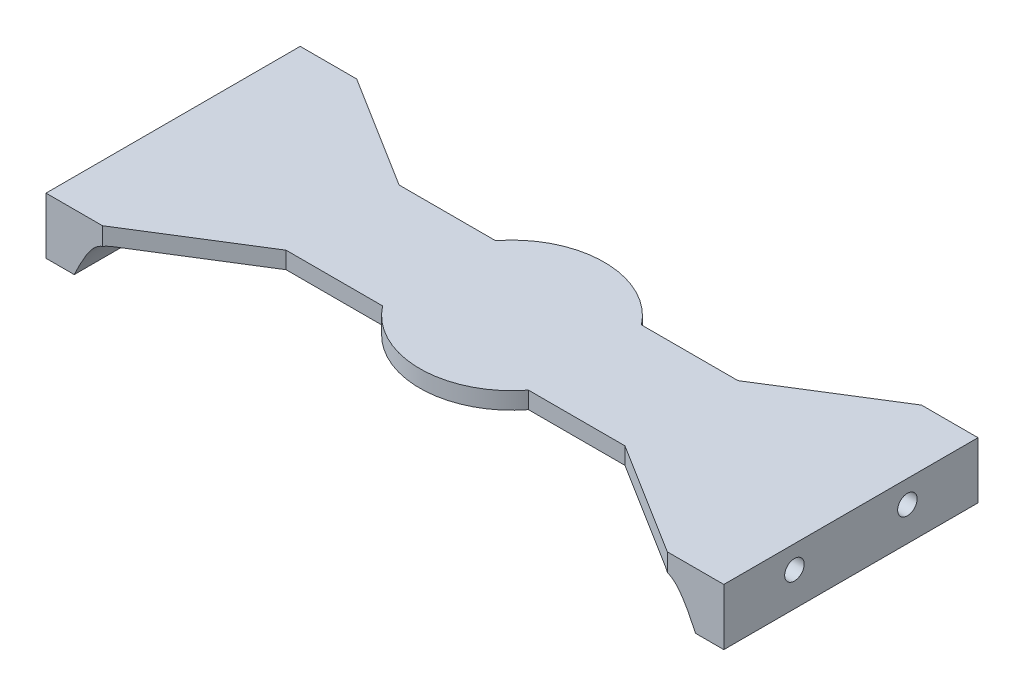
ISO-10303-21;
HEADER;
FILE_DESCRIPTION(('STEP AP214'),'2;1');
FILE_NAME('part.step','',(''),(''),'','','');
FILE_SCHEMA(('AUTOMOTIVE_DESIGN { 1 0 10303 214 1 1 1 1 }'));
ENDSEC;
DATA;
#1=APPLICATION_CONTEXT('core data for automotive mechanical design processes');
#2=APPLICATION_PROTOCOL_DEFINITION('international standard','automotive_design',2000,#1);
#3=PRODUCT_CONTEXT('',#1,'mechanical');
#4=PRODUCT('Part','Part','',(#3));
#5=PRODUCT_RELATED_PRODUCT_CATEGORY('part','',(#4));
#6=PRODUCT_DEFINITION_FORMATION('','',#4);
#7=PRODUCT_DEFINITION_CONTEXT('part definition',#1,'design');
#8=PRODUCT_DEFINITION('design','',#6,#7);
#9=PRODUCT_DEFINITION_SHAPE('','',#8);
#10=(LENGTH_UNIT() NAMED_UNIT(*) SI_UNIT(.MILLI.,.METRE.));
#11=(NAMED_UNIT(*) PLANE_ANGLE_UNIT() SI_UNIT($,.RADIAN.));
#12=(NAMED_UNIT(*) SI_UNIT($,.STERADIAN.) SOLID_ANGLE_UNIT());
#13=UNCERTAINTY_MEASURE_WITH_UNIT(LENGTH_MEASURE(1.E-05),#10,'distance_accuracy_value','');
#14=(GEOMETRIC_REPRESENTATION_CONTEXT(3) GLOBAL_UNCERTAINTY_ASSIGNED_CONTEXT((#13)) GLOBAL_UNIT_ASSIGNED_CONTEXT((#10,
#11,#12)) REPRESENTATION_CONTEXT('',''));
#15=CARTESIAN_POINT('',(0.,0.,0.));
#16=DIRECTION('',(0.,0.,1.));
#17=DIRECTION('',(1.,0.,0.));
#18=AXIS2_PLACEMENT_3D('',#15,#16,#17);
#19=CARTESIAN_POINT('',(30.0000000000001,3.,9.99999999999999));
#20=DIRECTION('',(0.,0.,-1.));
#21=DIRECTION('',(-1.,0.,0.));
#22=AXIS2_PLACEMENT_3D('',#19,#20,#21);
#23=PLANE('',#22);
#24=DIRECTION('',(1.,0.,0.));
#25=VECTOR('',#24,1.);
#26=CARTESIAN_POINT('',(30.0000000000001,0.,9.99999999999999));
#27=LINE('',#26,#25);
#28=CARTESIAN_POINT('',(-30.,0.,10.));
#29=VERTEX_POINT('',#28);
#30=CARTESIAN_POINT('',(-12.9126281933398,0.,10.));
#31=VERTEX_POINT('',#30);
#32=EDGE_CURVE('E71',#29,#31,#27,.T.);
#33=ORIENTED_EDGE('',*,*,#32,.T.);
#34=DIRECTION('',(0.,1.,0.));
#35=VECTOR('',#34,1.);
#36=CARTESIAN_POINT('',(-12.9126281933398,-46.1940227180474,10.));
#37=LINE('',#36,#35);
#38=CARTESIAN_POINT('',(-12.9126281933398,3.,10.));
#39=VERTEX_POINT('',#38);
#40=EDGE_CURVE('E233',#31,#39,#37,.T.);
#41=ORIENTED_EDGE('',*,*,#40,.T.);
#42=DIRECTION('',(1.,0.,0.));
#43=VECTOR('',#42,1.);
#44=CARTESIAN_POINT('',(30.0000000000001,3.,9.99999999999999));
#45=LINE('',#44,#43);
#46=CARTESIAN_POINT('',(-30.,3.,10.));
#47=VERTEX_POINT('',#46);
#48=EDGE_CURVE('E296',#47,#39,#45,.T.);
#49=ORIENTED_EDGE('',*,*,#48,.F.);
#50=DIRECTION('',(0.,-1.,0.));
#51=VECTOR('',#50,1.);
#52=CARTESIAN_POINT('',(-30.,3.,10.));
#53=LINE('',#52,#51);
#54=EDGE_CURVE('E591',#47,#29,#53,.T.);
#55=ORIENTED_EDGE('',*,*,#54,.T.);
#56=EDGE_LOOP('',(#33,#41,#49,#55));
#57=FACE_BOUND('',#56,.T.);
#58=ADVANCED_FACE('F51',(#57),#23,.F.);
#59=CARTESIAN_POINT('',(30.0000000000001,3.,-10.));
#60=DIRECTION('',(0.,0.,1.));
#61=DIRECTION('',(1.,0.,0.));
#62=AXIS2_PLACEMENT_3D('',#59,#60,#61);
#63=PLANE('',#62);
#64=DIRECTION('',(-1.,0.,0.));
#65=VECTOR('',#64,1.);
#66=CARTESIAN_POINT('',(30.0000000000001,0.,-10.));
#67=LINE('',#66,#65);
#68=CARTESIAN_POINT('',(30.0000000000001,0.,-10.));
#69=VERTEX_POINT('',#68);
#70=CARTESIAN_POINT('',(12.9126281933398,0.,-10.));
#71=VERTEX_POINT('',#70);
#72=EDGE_CURVE('E79',#69,#71,#67,.T.);
#73=ORIENTED_EDGE('',*,*,#72,.T.);
#74=DIRECTION('',(0.,1.,0.));
#75=VECTOR('',#74,1.);
#76=CARTESIAN_POINT('',(12.9126281933398,-46.1940227180474,-10.));
#77=LINE('',#76,#75);
#78=CARTESIAN_POINT('',(12.9126281933398,3.,-10.));
#79=VERTEX_POINT('',#78);
#80=EDGE_CURVE('E215',#71,#79,#77,.T.);
#81=ORIENTED_EDGE('',*,*,#80,.T.);
#82=DIRECTION('',(-1.,0.,0.));
#83=VECTOR('',#82,1.);
#84=CARTESIAN_POINT('',(30.0000000000001,3.,-10.));
#85=LINE('',#84,#83);
#86=CARTESIAN_POINT('',(30.0000000000001,3.,-10.));
#87=VERTEX_POINT('',#86);
#88=EDGE_CURVE('E315',#87,#79,#85,.T.);
#89=ORIENTED_EDGE('',*,*,#88,.F.);
#90=DIRECTION('',(0.,-1.,0.));
#91=VECTOR('',#90,1.);
#92=CARTESIAN_POINT('',(30.0000000000001,3.,-10.));
#93=LINE('',#92,#91);
#94=EDGE_CURVE('E572',#87,#69,#93,.T.);
#95=ORIENTED_EDGE('',*,*,#94,.T.);
#96=EDGE_LOOP('',(#73,#81,#89,#95));
#97=FACE_BOUND('',#96,.T.);
#98=ADVANCED_FACE('F777',(#97),#63,.F.);
#99=CARTESIAN_POINT('',(60.0000000000001,3.,-22.5));
#100=DIRECTION('',(-1.,0.,0.));
#101=DIRECTION('',(0.,0.,1.));
#102=AXIS2_PLACEMENT_3D('',#99,#100,#101);
#103=PLANE('',#102);
#104=CARTESIAN_POINT('',(60.,-1.,10.));
#105=DIRECTION('',(-1.,0.,0.));
#106=DIRECTION('',(0.,0.,1.));
#107=AXIS2_PLACEMENT_3D('',#104,#105,#106);
#108=CIRCLE('',#107,1.725);
#109=CARTESIAN_POINT('',(60.,-1.,11.725));
#110=VERTEX_POINT('',#109);
#111=EDGE_CURVE('E236',#110,#110,#108,.F.);
#112=ORIENTED_EDGE('',*,*,#111,.F.);
#113=EDGE_LOOP('',(#112));
#114=FACE_BOUND('',#113,.T.);
#115=DIRECTION('',(0.,-1.,0.));
#116=VECTOR('',#115,1.);
#117=CARTESIAN_POINT('',(60.0000000000001,3.,22.5));
#118=LINE('',#117,#116);
#119=CARTESIAN_POINT('',(60.0000000000001,3.,22.5));
#120=VERTEX_POINT('',#119);
#121=CARTESIAN_POINT('',(60.,-7.,22.5));
#122=VERTEX_POINT('',#121);
#123=EDGE_CURVE('E567',#120,#122,#118,.T.);
#124=ORIENTED_EDGE('',*,*,#123,.T.);
#125=DIRECTION('',(0.,0.,1.));
#126=VECTOR('',#125,1.);
#127=CARTESIAN_POINT('',(60.,-7.,0.));
#128=LINE('',#127,#126);
#129=CARTESIAN_POINT('',(60.,-7.,-22.5));
#130=VERTEX_POINT('',#129);
#131=EDGE_CURVE('E241',#130,#122,#128,.T.);
#132=ORIENTED_EDGE('',*,*,#131,.F.);
#133=DIRECTION('',(0.,-1.,0.));
#134=VECTOR('',#133,1.);
#135=CARTESIAN_POINT('',(60.0000000000001,3.,-22.5));
#136=LINE('',#135,#134);
#137=CARTESIAN_POINT('',(60.0000000000001,3.,-22.5));
#138=VERTEX_POINT('',#137);
#139=EDGE_CURVE('E571',#138,#130,#136,.T.);
#140=ORIENTED_EDGE('',*,*,#139,.F.);
#141=DIRECTION('',(0.,0.,-1.));
#142=VECTOR('',#141,1.);
#143=CARTESIAN_POINT('',(60.0000000000001,3.,-22.5));
#144=LINE('',#143,#142);
#145=EDGE_CURVE('E306',#120,#138,#144,.T.);
#146=ORIENTED_EDGE('',*,*,#145,.F.);
#147=EDGE_LOOP('',(#124,#132,#140,#146));
#148=FACE_BOUND('',#147,.T.);
#149=CARTESIAN_POINT('',(60.,-1.,-10.));
#150=DIRECTION('',(-1.,0.,0.));
#151=DIRECTION('',(0.,0.,1.));
#152=AXIS2_PLACEMENT_3D('',#149,#150,#151);
#153=CIRCLE('',#152,1.725);
#154=CARTESIAN_POINT('',(60.,-1.,-8.275));
#155=VERTEX_POINT('',#154);
#156=EDGE_CURVE('E242',#155,#155,#153,.T.);
#157=ORIENTED_EDGE('',*,*,#156,.T.);
#158=EDGE_LOOP('',(#157));
#159=FACE_BOUND('',#158,.T.);
#160=ADVANCED_FACE('F355',(#114,#148,#159),#103,.F.);
#161=CARTESIAN_POINT('',(0.,0.,0.));
#162=DIRECTION('',(0.,1.,0.));
#163=DIRECTION('',(0.,0.,1.));
#164=AXIS2_PLACEMENT_3D('',#161,#162,#163);
#165=PLANE('',#164);
#166=CARTESIAN_POINT('',(-12.9126281933398,0.,-10.));
#167=VERTEX_POINT('',#166);
#168=CARTESIAN_POINT('',(-30.,0.,-9.99999999999999));
#169=VERTEX_POINT('',#168);
#170=EDGE_CURVE('E194',#167,#169,#67,.T.);
#171=ORIENTED_EDGE('',*,*,#170,.F.);
#172=CARTESIAN_POINT('',(0.,0.,0.));
#173=DIRECTION('',(0.,1.,0.));
#174=DIRECTION('',(0.,0.,1.));
#175=AXIS2_PLACEMENT_3D('',#172,#173,#174);
#176=CIRCLE('',#175,16.3320533571084);
#177=EDGE_CURVE('E198',#167,#71,#176,.F.);
#178=ORIENTED_EDGE('',*,*,#177,.T.);
#179=ORIENTED_EDGE('',*,*,#72,.F.);
#180=DIRECTION('',(-0.847998304005088,0.,0.529998940003181));
#181=VECTOR('',#180,1.);
#182=CARTESIAN_POINT('',(30.0000000000001,0.,-10.));
#183=LINE('',#182,#181);
#184=CARTESIAN_POINT('',(48.6754446796632,0.,-21.6721529247895));
#185=VERTEX_POINT('',#184);
#186=EDGE_CURVE('E205',#185,#69,#183,.T.);
#187=ORIENTED_EDGE('',*,*,#186,.F.);
#188=CARTESIAN_POINT('',(48.6754446796632,0.,24.75));
#189=CARTESIAN_POINT('',(48.6754446796632,0.,8.25000000000001));
#190=CARTESIAN_POINT('',(48.6754446796632,0.,-8.25000000000001));
#191=CARTESIAN_POINT('',(48.6754446796632,0.,-24.75));
#192=B_SPLINE_CURVE_WITH_KNOTS('',3,(#188,#189,#190,#191),.UNSPECIFIED.,.F.,.F.,(4,4),(-0.02475,
0.02475),.UNSPECIFIED.);
#193=CARTESIAN_POINT('',(48.6754446796632,0.,21.6721529247895));
#194=VERTEX_POINT('',#193);
#195=EDGE_CURVE('E681',#185,#194,#192,.F.);
#196=ORIENTED_EDGE('',*,*,#195,.T.);
#197=DIRECTION('',(0.847998304005088,0.,0.52999894000318));
#198=VECTOR('',#197,1.);
#199=CARTESIAN_POINT('',(30.0000000000001,0.,9.99999999999999));
#200=LINE('',#199,#198);
#201=CARTESIAN_POINT('',(30.0000000000001,0.,9.99999999999999));
#202=VERTEX_POINT('',#201);
#203=EDGE_CURVE('E753',#202,#194,#200,.T.);
#204=ORIENTED_EDGE('',*,*,#203,.F.);
#205=CARTESIAN_POINT('',(12.9126281933398,0.,10.));
#206=VERTEX_POINT('',#205);
#207=EDGE_CURVE('E334',#206,#202,#27,.T.);
#208=ORIENTED_EDGE('',*,*,#207,.F.);
#209=EDGE_CURVE('E219',#206,#31,#176,.F.);
#210=ORIENTED_EDGE('',*,*,#209,.T.);
#211=ORIENTED_EDGE('',*,*,#32,.F.);
#212=DIRECTION('',(0.847998304005088,0.,-0.529998940003181));
#213=VECTOR('',#212,1.);
#214=CARTESIAN_POINT('',(-30.,0.,10.));
#215=LINE('',#214,#213);
#216=CARTESIAN_POINT('',(-48.6754446796632,0.,21.6721529247895));
#217=VERTEX_POINT('',#216);
#218=EDGE_CURVE('E328',#217,#29,#215,.T.);
#219=ORIENTED_EDGE('',*,*,#218,.F.);
#220=CARTESIAN_POINT('',(-48.6754446796632,0.,-24.75));
#221=CARTESIAN_POINT('',(-48.6754446796632,0.,-8.24999999999999));
#222=CARTESIAN_POINT('',(-48.6754446796632,0.,8.25000000000001));
#223=CARTESIAN_POINT('',(-48.6754446796632,0.,24.75));
#224=B_SPLINE_CURVE_WITH_KNOTS('',3,(#220,#221,#222,#223),.UNSPECIFIED.,.F.,.F.,(4,4),(-0.02475,
0.02475),.UNSPECIFIED.);
#225=CARTESIAN_POINT('',(-48.6754446796632,0.,-21.6721529247895));
#226=VERTEX_POINT('',#225);
#227=EDGE_CURVE('E338',#217,#226,#224,.F.);
#228=ORIENTED_EDGE('',*,*,#227,.T.);
#229=DIRECTION('',(-0.847998304005088,0.,-0.52999894000318));
#230=VECTOR('',#229,1.);
#231=CARTESIAN_POINT('',(-30.,0.,-9.99999999999999));
#232=LINE('',#231,#230);
#233=EDGE_CURVE('E200',#169,#226,#232,.T.);
#234=ORIENTED_EDGE('',*,*,#233,.F.);
#235=EDGE_LOOP('',(#171,#178,#179,#187,#196,#204,#208,#210,#211,#219,#228,#234));
#236=FACE_BOUND('',#235,.T.);
#237=ADVANCED_FACE('F196',(#236),#165,.F.);
#238=CARTESIAN_POINT('',(-60.,3.,-22.5));
#239=DIRECTION('',(1.,0.,0.));
#240=DIRECTION('',(0.,0.,-1.));
#241=AXIS2_PLACEMENT_3D('',#238,#239,#240);
#242=PLANE('',#241);
#243=DIRECTION('',(0.,-1.,0.));
#244=VECTOR('',#243,1.);
#245=CARTESIAN_POINT('',(-60.,3.,-22.5));
#246=LINE('',#245,#244);
#247=CARTESIAN_POINT('',(-60.,3.,-22.5));
#248=VERTEX_POINT('',#247);
#249=CARTESIAN_POINT('',(-60.,-7.,-22.5));
#250=VERTEX_POINT('',#249);
#251=EDGE_CURVE('E330',#248,#250,#246,.T.);
#252=ORIENTED_EDGE('',*,*,#251,.T.);
#253=DIRECTION('',(0.,0.,1.));
#254=VECTOR('',#253,1.);
#255=CARTESIAN_POINT('',(-60.,-7.,0.));
#256=LINE('',#255,#254);
#257=CARTESIAN_POINT('',(-60.,-7.,22.5));
#258=VERTEX_POINT('',#257);
#259=EDGE_CURVE('E261',#250,#258,#256,.T.);
#260=ORIENTED_EDGE('',*,*,#259,.T.);
#261=DIRECTION('',(0.,-1.,0.));
#262=VECTOR('',#261,1.);
#263=CARTESIAN_POINT('',(-60.,3.,22.5));
#264=LINE('',#263,#262);
#265=CARTESIAN_POINT('',(-60.,3.,22.5));
#266=VERTEX_POINT('',#265);
#267=EDGE_CURVE('E593',#266,#258,#264,.T.);
#268=ORIENTED_EDGE('',*,*,#267,.F.);
#269=DIRECTION('',(0.,0.,1.));
#270=VECTOR('',#269,1.);
#271=CARTESIAN_POINT('',(-60.,3.,-22.5));
#272=LINE('',#271,#270);
#273=EDGE_CURVE('E286',#248,#266,#272,.T.);
#274=ORIENTED_EDGE('',*,*,#273,.F.);
#275=EDGE_LOOP('',(#252,#260,#268,#274));
#276=FACE_BOUND('',#275,.T.);
#277=CARTESIAN_POINT('',(-60.,-1.,10.));
#278=DIRECTION('',(-1.,0.,0.));
#279=DIRECTION('',(0.,0.,1.));
#280=AXIS2_PLACEMENT_3D('',#277,#278,#279);
#281=CIRCLE('',#280,1.725);
#282=CARTESIAN_POINT('',(-60.,-1.,11.725));
#283=VERTEX_POINT('',#282);
#284=EDGE_CURVE('E270',#283,#283,#281,.F.);
#285=ORIENTED_EDGE('',*,*,#284,.T.);
#286=EDGE_LOOP('',(#285));
#287=FACE_BOUND('',#286,.T.);
#288=CARTESIAN_POINT('',(-60.,-1.,-10.));
#289=DIRECTION('',(-1.,0.,0.));
#290=DIRECTION('',(0.,0.,1.));
#291=AXIS2_PLACEMENT_3D('',#288,#289,#290);
#292=CIRCLE('',#291,1.725);
#293=CARTESIAN_POINT('',(-60.,-1.,-8.275));
#294=VERTEX_POINT('',#293);
#295=EDGE_CURVE('E262',#294,#294,#292,.T.);
#296=ORIENTED_EDGE('',*,*,#295,.F.);
#297=EDGE_LOOP('',(#296));
#298=FACE_BOUND('',#297,.T.);
#299=ADVANCED_FACE('F354',(#276,#287,#298),#242,.F.);
#300=CARTESIAN_POINT('',(-30.,3.,-9.99999999999999));
#301=DIRECTION('',(-0.52999894000318,0.,0.847998304005088));
#302=DIRECTION('',(0.847998304005088,0.,0.52999894000318));
#303=AXIS2_PLACEMENT_3D('',#300,#301,#302);
#304=PLANE('',#303);
#305=ORIENTED_EDGE('',*,*,#233,.T.);
#306=CARTESIAN_POINT('',(-50.0000000000001,-0.174023072215507,-22.5));
#307=CARTESIAN_POINT('',(-49.9511052127495,-0.157124597354064,-22.4694445362634));
#308=CARTESIAN_POINT('',(-49.9018367739735,-0.141527336185102,-22.4387683814262));
#309=CARTESIAN_POINT('',(-49.8013797694117,-0.112567300866798,-22.376333427405));
#310=CARTESIAN_POINT('',(-49.7501750960686,-0.0992754651749184,-22.3445676191217));
#311=CARTESIAN_POINT('',(-49.6460209080509,-0.0751686642259336,-22.2799480997207));
#312=CARTESIAN_POINT('',(-49.5930597490474,-0.0644238269324971,-22.2470870285744));
#313=CARTESIAN_POINT('',(-49.4855482466057,-0.0455213647415984,-22.1802777437784));
#314=CARTESIAN_POINT('',(-49.4309903485743,-0.0374322819956945,-22.1463224079821));
#315=CARTESIAN_POINT('',(-49.3203929810517,-0.023808457078312,-22.0773225754086));
#316=CARTESIAN_POINT('',(-49.2643495302256,-0.0183400668790125,-22.0422715689899));
#317=CARTESIAN_POINT('',(-49.1508003934218,-0.00972987617742308,-21.9710788111913));
#318=CARTESIAN_POINT('',(-49.0932934460123,-0.00665017276787988,-21.9349318303717));
#319=CARTESIAN_POINT('',(-48.9767041807487,-0.00236627654956601,-21.861538271778));
#320=CARTESIAN_POINT('',(-48.9176220220249,-0.00121597924425767,-21.8242887868701));
#321=CARTESIAN_POINT('',(-48.7975331353893,2.80956294215968E-06,-21.7486944386895));
#322=CARTESIAN_POINT('',(-48.7365244037665,3.60854025646855E-05,-21.7103520289778));
#323=CARTESIAN_POINT('',(-48.6754446796632,0.,-21.6721529247895));
#324=B_SPLINE_CURVE_WITH_KNOTS('',3,(#306,#307,#308,#309,#310,#311,#312,#313,#314,#315,#316,
#317,#318,#319,#320,#321,#322,#323),.UNSPECIFIED.,.F.,.F.,(4,2,2,2,2,2,2,2,4),(0.,
0.180231524739209,0.365284543124532,0.554957925127221,0.749199358277538,0.948128220442267,
1.15206966075091,1.36161848698124,1.57776762867678),.UNSPECIFIED.);
#325=CARTESIAN_POINT('',(-50.,-0.174023072215521,-22.5));
#326=VERTEX_POINT('',#325);
#327=EDGE_CURVE('E425',#226,#326,#324,.F.);
#328=ORIENTED_EDGE('',*,*,#327,.T.);
#329=DIRECTION('',(0.,-1.,0.));
#330=VECTOR('',#329,1.);
#331=CARTESIAN_POINT('',(-50.,3.,-22.5));
#332=LINE('',#331,#330);
#333=CARTESIAN_POINT('',(-50.,3.,-22.5));
#334=VERTEX_POINT('',#333);
#335=EDGE_CURVE('E601',#334,#326,#332,.T.);
#336=ORIENTED_EDGE('',*,*,#335,.F.);
#337=DIRECTION('',(-0.847998304005088,0.,-0.52999894000318));
#338=VECTOR('',#337,1.);
#339=CARTESIAN_POINT('',(-30.,3.,-9.99999999999999));
#340=LINE('',#339,#338);
#341=CARTESIAN_POINT('',(-30.,3.,-9.99999999999999));
#342=VERTEX_POINT('',#341);
#343=EDGE_CURVE('E279',#342,#334,#340,.T.);
#344=ORIENTED_EDGE('',*,*,#343,.F.);
#345=DIRECTION('',(0.,-1.,0.));
#346=VECTOR('',#345,1.);
#347=CARTESIAN_POINT('',(-30.,3.,-9.99999999999999));
#348=LINE('',#347,#346);
#349=EDGE_CURVE('E319',#342,#169,#348,.T.);
#350=ORIENTED_EDGE('',*,*,#349,.T.);
#351=EDGE_LOOP('',(#305,#328,#336,#344,#350));
#352=FACE_BOUND('',#351,.T.);
#353=ADVANCED_FACE('F432',(#352),#304,.F.);
#354=CARTESIAN_POINT('',(-50.,3.,-22.5));
#355=DIRECTION('',(0.,0.,1.));
#356=DIRECTION('',(1.,0.,0.));
#357=AXIS2_PLACEMENT_3D('',#354,#355,#356);
#358=PLANE('',#357);
#359=ORIENTED_EDGE('',*,*,#335,.T.);
#360=CARTESIAN_POINT('',(-55.,-7.,-22.5));
#361=CARTESIAN_POINT('',(-54.4087744832353,-5.75358717080906,-22.5));
#362=CARTESIAN_POINT('',(-53.8175489664707,-4.50717434161812,-22.5));
#363=CARTESIAN_POINT('',(-52.4100755832647,-1.89686037957567,-22.5));
#364=CARTESIAN_POINT('',(-51.0526530374568,-0.394468932369628,-22.5));
#365=CARTESIAN_POINT('',(-49.7452813290469,0.,-22.5));
#366=CARTESIAN_POINT('',(-49.2103630043551,0.,-22.5));
#367=CARTESIAN_POINT('',(-48.6754446796632,0.,-22.5));
#368=B_SPLINE_CURVE_WITH_KNOTS('',5,(#360,#361,#362,#363,#364,#365,#366,#367),.UNSPECIFIED.,.F.,
.F.,(6,2,6),(0.,0.5,1.),.UNSPECIFIED.);
#369=CARTESIAN_POINT('',(-55.,-7.,-22.5));
#370=VERTEX_POINT('',#369);
#371=EDGE_CURVE('E741',#326,#370,#368,.F.);
#372=ORIENTED_EDGE('',*,*,#371,.T.);
#373=DIRECTION('',(-1.,0.,0.));
#374=VECTOR('',#373,1.);
#375=CARTESIAN_POINT('',(-55.,-7.,-22.5));
#376=LINE('',#375,#374);
#377=EDGE_CURVE('E613',#370,#250,#376,.T.);
#378=ORIENTED_EDGE('',*,*,#377,.T.);
#379=ORIENTED_EDGE('',*,*,#251,.F.);
#380=DIRECTION('',(-1.,0.,0.));
#381=VECTOR('',#380,1.);
#382=CARTESIAN_POINT('',(-50.,3.,-22.5));
#383=LINE('',#382,#381);
#384=EDGE_CURVE('E283',#334,#248,#383,.T.);
#385=ORIENTED_EDGE('',*,*,#384,.F.);
#386=EDGE_LOOP('',(#359,#372,#378,#379,#385));
#387=FACE_BOUND('',#386,.T.);
#388=ADVANCED_FACE('F441',(#387),#358,.F.);
#389=CARTESIAN_POINT('',(-50.,3.,22.5));
#390=DIRECTION('',(0.,0.,-1.));
#391=DIRECTION('',(-1.,0.,0.));
#392=AXIS2_PLACEMENT_3D('',#389,#390,#391);
#393=PLANE('',#392);
#394=ORIENTED_EDGE('',*,*,#267,.T.);
#395=DIRECTION('',(-1.,0.,0.));
#396=VECTOR('',#395,1.);
#397=CARTESIAN_POINT('',(-55.,-7.,22.5));
#398=LINE('',#397,#396);
#399=CARTESIAN_POINT('',(-55.,-7.,22.5));
#400=VERTEX_POINT('',#399);
#401=EDGE_CURVE('E329',#400,#258,#398,.T.);
#402=ORIENTED_EDGE('',*,*,#401,.F.);
#403=CARTESIAN_POINT('',(-48.6754446796632,0.,22.5));
#404=CARTESIAN_POINT('',(-49.2103630043551,0.,22.5));
#405=CARTESIAN_POINT('',(-49.7452813290469,0.,22.5));
#406=CARTESIAN_POINT('',(-51.0526530374568,-0.394468932369628,22.5));
#407=CARTESIAN_POINT('',(-52.4100755832647,-1.89686037957567,22.5));
#408=CARTESIAN_POINT('',(-53.8175489664707,-4.50717434161812,22.5));
#409=CARTESIAN_POINT('',(-54.4087744832353,-5.75358717080906,22.5));
#410=CARTESIAN_POINT('',(-55.,-7.,22.5));
#411=B_SPLINE_CURVE_WITH_KNOTS('',5,(#403,#404,#405,#406,#407,#408,#409,#410),.UNSPECIFIED.,.F.,
.F.,(6,2,6),(0.,0.5,1.),.UNSPECIFIED.);
#412=CARTESIAN_POINT('',(-50.,-0.174023072215472,22.5));
#413=VERTEX_POINT('',#412);
#414=EDGE_CURVE('E607',#400,#413,#411,.F.);
#415=ORIENTED_EDGE('',*,*,#414,.T.);
#416=DIRECTION('',(0.,-1.,0.));
#417=VECTOR('',#416,1.);
#418=CARTESIAN_POINT('',(-50.,3.,22.5));
#419=LINE('',#418,#417);
#420=CARTESIAN_POINT('',(-50.,3.,22.5));
#421=VERTEX_POINT('',#420);
#422=EDGE_CURVE('E519',#421,#413,#419,.T.);
#423=ORIENTED_EDGE('',*,*,#422,.F.);
#424=DIRECTION('',(1.,0.,0.));
#425=VECTOR('',#424,1.);
#426=CARTESIAN_POINT('',(-50.,3.,22.5));
#427=LINE('',#426,#425);
#428=EDGE_CURVE('E289',#266,#421,#427,.T.);
#429=ORIENTED_EDGE('',*,*,#428,.F.);
#430=EDGE_LOOP('',(#394,#402,#415,#423,#429));
#431=FACE_BOUND('',#430,.T.);
#432=ADVANCED_FACE('F405',(#431),#393,.F.);
#433=CARTESIAN_POINT('',(-30.,3.,10.));
#434=DIRECTION('',(-0.52999894000318,0.,-0.847998304005088));
#435=DIRECTION('',(-0.847998304005088,0.,0.529998940003181));
#436=AXIS2_PLACEMENT_3D('',#433,#434,#435);
#437=PLANE('',#436);
#438=ORIENTED_EDGE('',*,*,#422,.T.);
#439=CARTESIAN_POINT('',(-48.6754446796632,0.,21.6721529247895));
#440=CARTESIAN_POINT('',(-48.7365244037665,3.60854025650941E-05,21.7103520289778));
#441=CARTESIAN_POINT('',(-48.7975331353892,2.80956294250802E-06,21.7486944386895));
#442=CARTESIAN_POINT('',(-48.9176220220249,-0.00121597924425701,21.8242887868701));
#443=CARTESIAN_POINT('',(-48.9767041807487,-0.00236627654956479,21.8615382717779));
#444=CARTESIAN_POINT('',(-49.0932934460122,-0.00665017276787552,21.9349318303716));
#445=CARTESIAN_POINT('',(-49.1508003934217,-0.00972987617741652,21.9710788111913));
#446=CARTESIAN_POINT('',(-49.2643495302255,-0.0183400668790023,22.0422715689898));
#447=CARTESIAN_POINT('',(-49.3203929810516,-0.0238084570783001,22.0773225754086));
#448=CARTESIAN_POINT('',(-49.4309903485742,-0.0374322819956771,22.146322407982));
#449=CARTESIAN_POINT('',(-49.4855482466056,-0.0455213647415781,22.1802777437783));
#450=CARTESIAN_POINT('',(-49.5930597490473,-0.0644238269324701,22.2470870285743));
#451=CARTESIAN_POINT('',(-49.6460209080507,-0.075168664225903,22.2799480997207));
#452=CARTESIAN_POINT('',(-49.7501750960685,-0.099275465174885,22.3445676191216));
#453=CARTESIAN_POINT('',(-49.8013797694116,-0.112567300866765,22.3763334274049));
#454=CARTESIAN_POINT('',(-49.9018367739733,-0.14152733618507,22.4387683814261));
#455=CARTESIAN_POINT('',(-49.9511052127494,-0.157124597354034,22.4694445362634));
#456=CARTESIAN_POINT('',(-50.,-0.174023072215474,22.5));
#457=B_SPLINE_CURVE_WITH_KNOTS('',3,(#439,#440,#441,#442,#443,#444,#445,#446,#447,#448,#449,
#450,#451,#452,#453,#454,#455,#456),.UNSPECIFIED.,.F.,.F.,(4,2,2,2,2,2,2,2,4),(0.,
0.216149141695519,0.425697967925783,0.629639408234396,0.82856827039908,1.02280970354941,
1.21248308555211,1.39753610393742,1.57776762867666),.UNSPECIFIED.);
#458=EDGE_CURVE('E605',#413,#217,#457,.F.);
#459=ORIENTED_EDGE('',*,*,#458,.T.);
#460=ORIENTED_EDGE('',*,*,#218,.T.);
#461=ORIENTED_EDGE('',*,*,#54,.F.);
#462=DIRECTION('',(0.847998304005088,0.,-0.529998940003181));
#463=VECTOR('',#462,1.);
#464=CARTESIAN_POINT('',(-30.,3.,10.));
#465=LINE('',#464,#463);
#466=EDGE_CURVE('E292',#421,#47,#465,.T.);
#467=ORIENTED_EDGE('',*,*,#466,.F.);
#468=EDGE_LOOP('',(#438,#459,#460,#461,#467));
#469=FACE_BOUND('',#468,.T.);
#470=ADVANCED_FACE('F400',(#469),#437,.F.);
#471=CARTESIAN_POINT('',(12.9126281933398,3.,10.));
#472=VERTEX_POINT('',#471);
#473=CARTESIAN_POINT('',(30.0000000000001,3.,9.99999999999999));
#474=VERTEX_POINT('',#473);
#475=EDGE_CURVE('E295',#472,#474,#45,.T.);
#476=ORIENTED_EDGE('',*,*,#475,.F.);
#477=DIRECTION('',(0.,1.,0.));
#478=VECTOR('',#477,1.);
#479=CARTESIAN_POINT('',(12.9126281933398,-46.1940227180474,10.));
#480=LINE('',#479,#478);
#481=EDGE_CURVE('E229',#472,#206,#480,.F.);
#482=ORIENTED_EDGE('',*,*,#481,.T.);
#483=ORIENTED_EDGE('',*,*,#207,.T.);
#484=DIRECTION('',(0.,-1.,0.));
#485=VECTOR('',#484,1.);
#486=CARTESIAN_POINT('',(30.0000000000001,3.,9.99999999999999));
#487=LINE('',#486,#485);
#488=EDGE_CURVE('E566',#474,#202,#487,.T.);
#489=ORIENTED_EDGE('',*,*,#488,.F.);
#490=EDGE_LOOP('',(#476,#482,#483,#489));
#491=FACE_BOUND('',#490,.T.);
#492=ADVANCED_FACE('F395',(#491),#23,.F.);
#493=CARTESIAN_POINT('',(30.0000000000001,3.,9.99999999999999));
#494=DIRECTION('',(0.52999894000318,0.,-0.847998304005088));
#495=DIRECTION('',(-0.847998304005088,0.,-0.52999894000318));
#496=AXIS2_PLACEMENT_3D('',#493,#494,#495);
#497=PLANE('',#496);
#498=ORIENTED_EDGE('',*,*,#203,.T.);
#499=CARTESIAN_POINT('',(50.0000000000002,-0.174023072215527,22.5));
#500=CARTESIAN_POINT('',(49.9511052127496,-0.157124597354086,22.4694445362634));
#501=CARTESIAN_POINT('',(49.9018367739735,-0.141527336185124,22.4387683814262));
#502=CARTESIAN_POINT('',(49.8013797694118,-0.112567300866819,22.376333427405));
#503=CARTESIAN_POINT('',(49.7501750960687,-0.0992754651749378,22.3445676191217));
#504=CARTESIAN_POINT('',(49.6460209080509,-0.0751686642259505,22.2799480997207));
#505=CARTESIAN_POINT('',(49.5930597490475,-0.0644238269325132,22.2470870285744));
#506=CARTESIAN_POINT('',(49.4855482466058,-0.0455213647416116,22.1802777437784));
#507=CARTESIAN_POINT('',(49.4309903485744,-0.0374322819957056,22.1463224079821));
#508=CARTESIAN_POINT('',(49.3203929810518,-0.0238084570783194,22.0773225754087));
#509=CARTESIAN_POINT('',(49.2643495302257,-0.0183400668790186,22.0422715689899));
#510=CARTESIAN_POINT('',(49.1508003934219,-0.00972987617742675,21.9710788111913));
#511=CARTESIAN_POINT('',(49.0932934460124,-0.00665017276788244,21.9349318303717));
#512=CARTESIAN_POINT('',(48.9767041807488,-0.00236627654956696,21.861538271778));
#513=CARTESIAN_POINT('',(48.9176220220249,-0.00121597924425818,21.8242887868701));
#514=CARTESIAN_POINT('',(48.7975331353893,2.80956294218753E-06,21.7486944386894));
#515=CARTESIAN_POINT('',(48.7365244037665,3.60854025646796E-05,21.7103520289778));
#516=CARTESIAN_POINT('',(48.6754446796632,0.,21.6721529247895));
#517=B_SPLINE_CURVE_WITH_KNOTS('',3,(#499,#500,#501,#502,#503,#504,#505,#506,#507,#508,#509,
#510,#511,#512,#513,#514,#515,#516),.UNSPECIFIED.,.F.,.F.,(4,2,2,2,2,2,2,2,4),(0.,
0.18023152473919,0.365284543124495,0.554957925127186,0.749199358277502,0.948128220442245,
1.15206966075091,1.36161848698126,1.57776762867685),.UNSPECIFIED.);
#518=CARTESIAN_POINT('',(50.0000000000001,-0.174023072215538,22.5));
#519=VERTEX_POINT('',#518);
#520=EDGE_CURVE('E377',#194,#519,#517,.F.);
#521=ORIENTED_EDGE('',*,*,#520,.T.);
#522=DIRECTION('',(0.,-1.,0.));
#523=VECTOR('',#522,1.);
#524=CARTESIAN_POINT('',(50.0000000000001,3.,22.5));
#525=LINE('',#524,#523);
#526=CARTESIAN_POINT('',(50.0000000000001,3.,22.5));
#527=VERTEX_POINT('',#526);
#528=EDGE_CURVE('E558',#527,#519,#525,.T.);
#529=ORIENTED_EDGE('',*,*,#528,.F.);
#530=DIRECTION('',(0.847998304005088,0.,0.52999894000318));
#531=VECTOR('',#530,1.);
#532=CARTESIAN_POINT('',(30.0000000000001,3.,9.99999999999999));
#533=LINE('',#532,#531);
#534=EDGE_CURVE('E300',#474,#527,#533,.T.);
#535=ORIENTED_EDGE('',*,*,#534,.F.);
#536=ORIENTED_EDGE('',*,*,#488,.T.);
#537=EDGE_LOOP('',(#498,#521,#529,#535,#536));
#538=FACE_BOUND('',#537,.T.);
#539=ADVANCED_FACE('F384',(#538),#497,.F.);
#540=CARTESIAN_POINT('',(50.0000000000001,3.,22.5));
#541=DIRECTION('',(0.,0.,-1.));
#542=DIRECTION('',(-1.,0.,0.));
#543=AXIS2_PLACEMENT_3D('',#540,#541,#542);
#544=PLANE('',#543);
#545=ORIENTED_EDGE('',*,*,#528,.T.);
#546=CARTESIAN_POINT('',(55.,-7.,22.5));
#547=CARTESIAN_POINT('',(54.4087744832353,-5.75358717080906,22.5));
#548=CARTESIAN_POINT('',(53.8175489664707,-4.50717434161812,22.5));
#549=CARTESIAN_POINT('',(52.4100755832647,-1.89686037957567,22.5));
#550=CARTESIAN_POINT('',(51.0526530374568,-0.39446893236963,22.5));
#551=CARTESIAN_POINT('',(49.7452813290469,0.,22.5));
#552=CARTESIAN_POINT('',(49.2103630043551,0.,22.5));
#553=CARTESIAN_POINT('',(48.6754446796632,0.,22.5));
#554=B_SPLINE_CURVE_WITH_KNOTS('',5,(#546,#547,#548,#549,#550,#551,#552,#553),.UNSPECIFIED.,.F.,
.F.,(6,2,6),(0.,0.5,1.),.UNSPECIFIED.);
#555=CARTESIAN_POINT('',(55.,-7.,22.5));
#556=VERTEX_POINT('',#555);
#557=EDGE_CURVE('E641',#519,#556,#554,.F.);
#558=ORIENTED_EDGE('',*,*,#557,.T.);
#559=DIRECTION('',(1.,0.,0.));
#560=VECTOR('',#559,1.);
#561=CARTESIAN_POINT('',(55.,-7.,22.5));
#562=LINE('',#561,#560);
#563=EDGE_CURVE('E632',#556,#122,#562,.T.);
#564=ORIENTED_EDGE('',*,*,#563,.T.);
#565=ORIENTED_EDGE('',*,*,#123,.F.);
#566=DIRECTION('',(1.,0.,0.));
#567=VECTOR('',#566,1.);
#568=CARTESIAN_POINT('',(50.0000000000001,3.,22.5));
#569=LINE('',#568,#567);
#570=EDGE_CURVE('E303',#527,#120,#569,.T.);
#571=ORIENTED_EDGE('',*,*,#570,.F.);
#572=EDGE_LOOP('',(#545,#558,#564,#565,#571));
#573=FACE_BOUND('',#572,.T.);
#574=ADVANCED_FACE('F394',(#573),#544,.F.);
#575=CARTESIAN_POINT('',(50.,3.,-22.5));
#576=DIRECTION('',(0.,0.,1.));
#577=DIRECTION('',(1.,0.,0.));
#578=AXIS2_PLACEMENT_3D('',#575,#576,#577);
#579=PLANE('',#578);
#580=ORIENTED_EDGE('',*,*,#139,.T.);
#581=DIRECTION('',(1.,0.,0.));
#582=VECTOR('',#581,1.);
#583=CARTESIAN_POINT('',(55.,-7.,-22.5));
#584=LINE('',#583,#582);
#585=CARTESIAN_POINT('',(55.,-7.,-22.5));
#586=VERTEX_POINT('',#585);
#587=EDGE_CURVE('E274',#586,#130,#584,.T.);
#588=ORIENTED_EDGE('',*,*,#587,.F.);
#589=CARTESIAN_POINT('',(48.6754446796632,0.,-22.5));
#590=CARTESIAN_POINT('',(49.2103630043551,0.,-22.5));
#591=CARTESIAN_POINT('',(49.7452813290469,0.,-22.5));
#592=CARTESIAN_POINT('',(51.0526530374568,-0.39446893236963,-22.5));
#593=CARTESIAN_POINT('',(52.4100755832647,-1.89686037957567,-22.5));
#594=CARTESIAN_POINT('',(53.8175489664707,-4.50717434161812,-22.5));
#595=CARTESIAN_POINT('',(54.4087744832353,-5.75358717080906,-22.5));
#596=CARTESIAN_POINT('',(55.,-7.,-22.5));
#597=B_SPLINE_CURVE_WITH_KNOTS('',5,(#589,#590,#591,#592,#593,#594,#595,#596),.UNSPECIFIED.,.F.,
.F.,(6,2,6),(0.,0.5,1.),.UNSPECIFIED.);
#598=CARTESIAN_POINT('',(50.,-0.174023072215494,-22.5));
#599=VERTEX_POINT('',#598);
#600=EDGE_CURVE('E64',#586,#599,#597,.F.);
#601=ORIENTED_EDGE('',*,*,#600,.T.);
#602=DIRECTION('',(0.,-1.,0.));
#603=VECTOR('',#602,1.);
#604=CARTESIAN_POINT('',(50.,3.,-22.5));
#605=LINE('',#604,#603);
#606=CARTESIAN_POINT('',(50.,3.,-22.5));
#607=VERTEX_POINT('',#606);
#608=EDGE_CURVE('E569',#607,#599,#605,.T.);
#609=ORIENTED_EDGE('',*,*,#608,.F.);
#610=DIRECTION('',(-1.,0.,0.));
#611=VECTOR('',#610,1.);
#612=CARTESIAN_POINT('',(50.,3.,-22.5));
#613=LINE('',#612,#611);
#614=EDGE_CURVE('E309',#138,#607,#613,.T.);
#615=ORIENTED_EDGE('',*,*,#614,.F.);
#616=EDGE_LOOP('',(#580,#588,#601,#609,#615));
#617=FACE_BOUND('',#616,.T.);
#618=ADVANCED_FACE('F712',(#617),#579,.F.);
#619=CARTESIAN_POINT('',(30.0000000000001,3.,-10.));
#620=DIRECTION('',(0.52999894000318,0.,0.847998304005088));
#621=DIRECTION('',(0.847998304005088,0.,-0.529998940003181));
#622=AXIS2_PLACEMENT_3D('',#619,#620,#621);
#623=PLANE('',#622);
#624=ORIENTED_EDGE('',*,*,#608,.T.);
#625=CARTESIAN_POINT('',(48.6754446796632,0.,-21.6721529247895));
#626=CARTESIAN_POINT('',(48.7365244037665,3.60854025648316E-05,-21.7103520289778));
#627=CARTESIAN_POINT('',(48.7975331353893,2.80956294225857E-06,-21.7486944386895));
#628=CARTESIAN_POINT('',(48.9176220220249,-0.00121597924425816,-21.8242887868701));
#629=CARTESIAN_POINT('',(48.9767041807488,-0.00236627654956692,-21.861538271778));
#630=CARTESIAN_POINT('',(49.0932934460124,-0.00665017276788182,-21.9349318303717));
#631=CARTESIAN_POINT('',(49.1508003934219,-0.00972987617742561,-21.9710788111913));
#632=CARTESIAN_POINT('',(49.2643495302256,-0.0183400668790167,-22.0422715689899));
#633=CARTESIAN_POINT('',(49.3203929810517,-0.0238084570783171,-22.0773225754087));
#634=CARTESIAN_POINT('',(49.4309903485744,-0.037432281995701,-22.1463224079821));
#635=CARTESIAN_POINT('',(49.4855482466058,-0.0455213647416053,-22.1802777437784));
#636=CARTESIAN_POINT('',(49.5930597490474,-0.0644238269325039,-22.2470870285744));
#637=CARTESIAN_POINT('',(49.6460209080509,-0.0751686642259398,-22.2799480997207));
#638=CARTESIAN_POINT('',(49.7501750960687,-0.0992754651749221,-22.3445676191217));
#639=CARTESIAN_POINT('',(49.8013797694117,-0.1125673008668,-22.376333427405));
#640=CARTESIAN_POINT('',(49.9018367739734,-0.141527336185097,-22.4387683814261));
#641=CARTESIAN_POINT('',(49.9511052127495,-0.157124597354055,-22.4694445362634));
#642=CARTESIAN_POINT('',(50.0000000000001,-0.174023072215493,-22.5));
#643=B_SPLINE_CURVE_WITH_KNOTS('',3,(#625,#626,#627,#628,#629,#630,#631,#632,#633,#634,#635,
#636,#637,#638,#639,#640,#641,#642),.UNSPECIFIED.,.F.,.F.,(4,2,2,2,2,2,2,2,4),(0.,
0.21614914169558,0.425697967925924,0.62963940823458,0.828568270399303,1.02280970354961,
1.21248308555228,1.39753610393757,1.57776762867673),.UNSPECIFIED.);
#644=EDGE_CURVE('E12',#599,#185,#643,.F.);
#645=ORIENTED_EDGE('',*,*,#644,.T.);
#646=ORIENTED_EDGE('',*,*,#186,.T.);
#647=ORIENTED_EDGE('',*,*,#94,.F.);
#648=DIRECTION('',(-0.847998304005088,0.,0.529998940003181));
#649=VECTOR('',#648,1.);
#650=CARTESIAN_POINT('',(30.0000000000001,3.,-10.));
#651=LINE('',#650,#649);
#652=EDGE_CURVE('E312',#607,#87,#651,.T.);
#653=ORIENTED_EDGE('',*,*,#652,.F.);
#654=EDGE_LOOP('',(#624,#645,#646,#647,#653));
#655=FACE_BOUND('',#654,.T.);
#656=ADVANCED_FACE('F703',(#655),#623,.F.);
#657=CARTESIAN_POINT('',(-12.9126281933398,3.,-10.));
#658=VERTEX_POINT('',#657);
#659=EDGE_CURVE('E210',#658,#342,#85,.T.);
#660=ORIENTED_EDGE('',*,*,#659,.F.);
#661=DIRECTION('',(0.,1.,0.));
#662=VECTOR('',#661,1.);
#663=CARTESIAN_POINT('',(-12.9126281933398,-46.1940227180474,-10.));
#664=LINE('',#663,#662);
#665=EDGE_CURVE('E208',#658,#167,#664,.F.);
#666=ORIENTED_EDGE('',*,*,#665,.T.);
#667=ORIENTED_EDGE('',*,*,#170,.T.);
#668=ORIENTED_EDGE('',*,*,#349,.F.);
#669=EDGE_LOOP('',(#660,#666,#667,#668));
#670=FACE_BOUND('',#669,.T.);
#671=ADVANCED_FACE('F209',(#670),#63,.F.);
#672=CARTESIAN_POINT('',(0.,3.,0.));
#673=DIRECTION('',(0.,1.,0.));
#674=DIRECTION('',(0.,0.,1.));
#675=AXIS2_PLACEMENT_3D('',#672,#673,#674);
#676=PLANE('',#675);
#677=ORIENTED_EDGE('',*,*,#48,.T.);
#678=CARTESIAN_POINT('',(0.,3.,0.));
#679=DIRECTION('',(0.,1.,0.));
#680=DIRECTION('',(0.,0.,1.));
#681=AXIS2_PLACEMENT_3D('',#678,#679,#680);
#682=CIRCLE('',#681,16.3320533571084);
#683=EDGE_CURVE('E225',#39,#472,#682,.T.);
#684=ORIENTED_EDGE('',*,*,#683,.T.);
#685=ORIENTED_EDGE('',*,*,#475,.T.);
#686=ORIENTED_EDGE('',*,*,#534,.T.);
#687=ORIENTED_EDGE('',*,*,#570,.T.);
#688=ORIENTED_EDGE('',*,*,#145,.T.);
#689=ORIENTED_EDGE('',*,*,#614,.T.);
#690=ORIENTED_EDGE('',*,*,#652,.T.);
#691=ORIENTED_EDGE('',*,*,#88,.T.);
#692=EDGE_CURVE('E223',#79,#658,#682,.T.);
#693=ORIENTED_EDGE('',*,*,#692,.T.);
#694=ORIENTED_EDGE('',*,*,#659,.T.);
#695=ORIENTED_EDGE('',*,*,#343,.T.);
#696=ORIENTED_EDGE('',*,*,#384,.T.);
#697=ORIENTED_EDGE('',*,*,#273,.T.);
#698=ORIENTED_EDGE('',*,*,#428,.T.);
#699=ORIENTED_EDGE('',*,*,#466,.T.);
#700=EDGE_LOOP('',(#677,#684,#685,#686,#687,#688,#689,#690,#691,#693,#694,#695,#696,#697,#698,#699));
#701=FACE_BOUND('',#700,.T.);
#702=ADVANCED_FACE('F356',(#701),#676,.T.);
#703=CARTESIAN_POINT('',(-55.,-7.,0.));
#704=DIRECTION('',(0.,-1.,0.));
#705=DIRECTION('',(0.,0.,-1.));
#706=AXIS2_PLACEMENT_3D('',#703,#704,#705);
#707=PLANE('',#706);
#708=ORIENTED_EDGE('',*,*,#259,.F.);
#709=ORIENTED_EDGE('',*,*,#377,.F.);
#710=CARTESIAN_POINT('',(-55.,-7.,24.75));
#711=CARTESIAN_POINT('',(-55.,-7.,8.25000000000001));
#712=CARTESIAN_POINT('',(-55.,-7.,-8.24999999999999));
#713=CARTESIAN_POINT('',(-55.,-7.,-24.75));
#714=B_SPLINE_CURVE_WITH_KNOTS('',3,(#710,#711,#712,#713),.UNSPECIFIED.,.F.,.F.,(4,4),(-0.02475,
0.02475),.UNSPECIFIED.);
#715=EDGE_CURVE('E278',#370,#400,#714,.F.);
#716=ORIENTED_EDGE('',*,*,#715,.T.);
#717=ORIENTED_EDGE('',*,*,#401,.T.);
#718=EDGE_LOOP('',(#708,#709,#716,#717));
#719=FACE_BOUND('',#718,.T.);
#720=ADVANCED_FACE('F452',(#719),#707,.T.);
#721=CARTESIAN_POINT('',(-48.6754446796632,0.,24.75));
#722=CARTESIAN_POINT('',(-48.6754446796632,0.,8.25000000000001));
#723=CARTESIAN_POINT('',(-48.6754446796632,0.,-8.24999999999999));
#724=CARTESIAN_POINT('',(-48.6754446796632,0.,-24.75));
#725=CARTESIAN_POINT('',(-49.2103630043551,0.,24.75));
#726=CARTESIAN_POINT('',(-49.2103630043551,0.,8.25000000000001));
#727=CARTESIAN_POINT('',(-49.2103630043551,0.,-8.24999999999999));
#728=CARTESIAN_POINT('',(-49.2103630043551,0.,-24.75));
#729=CARTESIAN_POINT('',(-49.7452813290469,0.,24.75));
#730=CARTESIAN_POINT('',(-49.7452813290469,0.,8.25000000000001));
#731=CARTESIAN_POINT('',(-49.7452813290469,0.,-8.24999999999999));
#732=CARTESIAN_POINT('',(-49.7452813290469,0.,-24.75));
#733=CARTESIAN_POINT('',(-51.0526530374568,-0.394468932369628,24.75));
#734=CARTESIAN_POINT('',(-51.0526530374568,-0.394468932369628,8.25000000000001));
#735=CARTESIAN_POINT('',(-51.0526530374568,-0.394468932369628,-8.24999999999999));
#736=CARTESIAN_POINT('',(-51.0526530374568,-0.394468932369628,-24.75));
#737=CARTESIAN_POINT('',(-52.4100755832647,-1.89686037957567,24.75));
#738=CARTESIAN_POINT('',(-52.4100755832647,-1.89686037957567,8.25000000000001));
#739=CARTESIAN_POINT('',(-52.4100755832647,-1.89686037957567,-8.24999999999999));
#740=CARTESIAN_POINT('',(-52.4100755832647,-1.89686037957567,-24.75));
#741=CARTESIAN_POINT('',(-53.8175489664707,-4.50717434161812,24.75));
#742=CARTESIAN_POINT('',(-53.8175489664707,-4.50717434161812,8.25000000000001));
#743=CARTESIAN_POINT('',(-53.8175489664707,-4.50717434161812,-8.24999999999999));
#744=CARTESIAN_POINT('',(-53.8175489664707,-4.50717434161812,-24.75));
#745=CARTESIAN_POINT('',(-54.4087744832353,-5.75358717080906,24.75));
#746=CARTESIAN_POINT('',(-54.4087744832353,-5.75358717080906,8.25000000000001));
#747=CARTESIAN_POINT('',(-54.4087744832353,-5.75358717080906,-8.24999999999999));
#748=CARTESIAN_POINT('',(-54.4087744832353,-5.75358717080906,-24.75));
#749=CARTESIAN_POINT('',(-55.,-7.,24.75));
#750=CARTESIAN_POINT('',(-55.,-7.,8.25000000000001));
#751=CARTESIAN_POINT('',(-55.,-7.,-8.24999999999999));
#752=CARTESIAN_POINT('',(-55.,-7.,-24.75));
#753=B_SPLINE_SURFACE_WITH_KNOTS('',5,3,((#721,#722,#723,#724),(#725,#726,#727,#728),(#729,#730,
#731,#732),(#733,#734,#735,#736),(#737,#738,#739,#740),(#741,#742,#743,#744),(#745,#746,#747,
#748),(#749,#750,#751,#752)),.UNSPECIFIED.,.F.,.F.,.F.,(6,2,6),(4,4),(0.,0.5,1.),(-0.02475,
0.02475),.UNSPECIFIED.);
#754=ORIENTED_EDGE('',*,*,#327,.F.);
#755=ORIENTED_EDGE('',*,*,#227,.F.);
#756=ORIENTED_EDGE('',*,*,#458,.F.);
#757=ORIENTED_EDGE('',*,*,#414,.F.);
#758=ORIENTED_EDGE('',*,*,#715,.F.);
#759=ORIENTED_EDGE('',*,*,#371,.F.);
#760=EDGE_LOOP('',(#754,#755,#756,#757,#758,#759));
#761=FACE_BOUND('',#760,.T.);
#762=ADVANCED_FACE('F444',(#761),#753,.T.);
#763=CARTESIAN_POINT('',(-55.,-1.,10.));
#764=DIRECTION('',(-1.,0.,0.));
#765=DIRECTION('',(0.,0.,1.));
#766=AXIS2_PLACEMENT_3D('',#763,#764,#765);
#767=CYLINDRICAL_SURFACE('',#766,1.725);
#768=CARTESIAN_POINT('',(-55.,-1.,10.));
#769=DIRECTION('',(-1.,0.,0.));
#770=DIRECTION('',(0.,0.,1.));
#771=AXIS2_PLACEMENT_3D('',#768,#769,#770);
#772=CIRCLE('',#771,1.725);
#773=CARTESIAN_POINT('',(-55.,-1.,11.725));
#774=VERTEX_POINT('',#773);
#775=EDGE_CURVE('E266',#774,#774,#772,.F.);
#776=ORIENTED_EDGE('',*,*,#775,.T.);
#777=EDGE_LOOP('',(#776));
#778=FACE_BOUND('',#777,.T.);
#779=ORIENTED_EDGE('',*,*,#284,.F.);
#780=EDGE_LOOP('',(#779));
#781=FACE_BOUND('',#780,.T.);
#782=ADVANCED_FACE('F451',(#778,#781),#767,.F.);
#783=CARTESIAN_POINT('',(-55.,0.,0.));
#784=DIRECTION('',(-1.,0.,0.));
#785=DIRECTION('',(0.,0.,1.));
#786=AXIS2_PLACEMENT_3D('',#783,#784,#785);
#787=PLANE('',#786);
#788=ORIENTED_EDGE('',*,*,#775,.F.);
#789=EDGE_LOOP('',(#788));
#790=FACE_BOUND('',#789,.T.);
#791=ADVANCED_FACE('F531',(#790),#787,.T.);
#792=CARTESIAN_POINT('',(-55.,-1.,-10.));
#793=DIRECTION('',(-1.,0.,0.));
#794=DIRECTION('',(0.,0.,1.));
#795=AXIS2_PLACEMENT_3D('',#792,#793,#794);
#796=CYLINDRICAL_SURFACE('',#795,1.725);
#797=CARTESIAN_POINT('',(-55.,-1.,-10.));
#798=DIRECTION('',(-1.,0.,0.));
#799=DIRECTION('',(0.,0.,1.));
#800=AXIS2_PLACEMENT_3D('',#797,#798,#799);
#801=CIRCLE('',#800,1.725);
#802=CARTESIAN_POINT('',(-55.,-1.,-8.275));
#803=VERTEX_POINT('',#802);
#804=EDGE_CURVE('E257',#803,#803,#801,.T.);
#805=ORIENTED_EDGE('',*,*,#804,.F.);
#806=EDGE_LOOP('',(#805));
#807=FACE_BOUND('',#806,.T.);
#808=ORIENTED_EDGE('',*,*,#295,.T.);
#809=EDGE_LOOP('',(#808));
#810=FACE_BOUND('',#809,.T.);
#811=ADVANCED_FACE('F535',(#807,#810),#796,.F.);
#812=CARTESIAN_POINT('',(-55.,0.,0.));
#813=DIRECTION('',(-1.,0.,0.));
#814=DIRECTION('',(0.,0.,1.));
#815=AXIS2_PLACEMENT_3D('',#812,#813,#814);
#816=PLANE('',#815);
#817=ORIENTED_EDGE('',*,*,#804,.T.);
#818=EDGE_LOOP('',(#817));
#819=FACE_BOUND('',#818,.T.);
#820=ADVANCED_FACE('F539',(#819),#816,.T.);
#821=CARTESIAN_POINT('',(55.,-7.,0.));
#822=DIRECTION('',(0.,1.,0.));
#823=DIRECTION('',(0.,0.,1.));
#824=AXIS2_PLACEMENT_3D('',#821,#822,#823);
#825=PLANE('',#824);
#826=ORIENTED_EDGE('',*,*,#131,.T.);
#827=ORIENTED_EDGE('',*,*,#563,.F.);
#828=CARTESIAN_POINT('',(55.,-7.,-24.75));
#829=CARTESIAN_POINT('',(55.,-7.,-8.25000000000001));
#830=CARTESIAN_POINT('',(55.,-7.,8.25000000000001));
#831=CARTESIAN_POINT('',(55.,-7.,24.75));
#832=B_SPLINE_CURVE_WITH_KNOTS('',3,(#828,#829,#830,#831),.UNSPECIFIED.,.F.,.F.,(4,4),(-0.02475,
0.02475),.UNSPECIFIED.);
#833=EDGE_CURVE('E256',#586,#556,#832,.T.);
#834=ORIENTED_EDGE('',*,*,#833,.F.);
#835=ORIENTED_EDGE('',*,*,#587,.T.);
#836=EDGE_LOOP('',(#826,#827,#834,#835));
#837=FACE_BOUND('',#836,.T.);
#838=ADVANCED_FACE('F543',(#837),#825,.F.);
#839=CARTESIAN_POINT('',(55.,-7.,24.75));
#840=CARTESIAN_POINT('',(55.,-7.,8.25000000000001));
#841=CARTESIAN_POINT('',(55.,-7.,-8.25000000000001));
#842=CARTESIAN_POINT('',(55.,-7.,-24.75));
#843=CARTESIAN_POINT('',(54.4087744832353,-5.75358717080906,24.75));
#844=CARTESIAN_POINT('',(54.4087744832353,-5.75358717080906,8.25000000000001));
#845=CARTESIAN_POINT('',(54.4087744832353,-5.75358717080906,-8.25000000000001));
#846=CARTESIAN_POINT('',(54.4087744832353,-5.75358717080906,-24.75));
#847=CARTESIAN_POINT('',(53.8175489664707,-4.50717434161812,24.75));
#848=CARTESIAN_POINT('',(53.8175489664707,-4.50717434161812,8.25000000000001));
#849=CARTESIAN_POINT('',(53.8175489664707,-4.50717434161812,-8.25000000000001));
#850=CARTESIAN_POINT('',(53.8175489664707,-4.50717434161812,-24.75));
#851=CARTESIAN_POINT('',(52.4100755832647,-1.89686037957567,24.75));
#852=CARTESIAN_POINT('',(52.4100755832647,-1.89686037957567,8.25000000000001));
#853=CARTESIAN_POINT('',(52.4100755832647,-1.89686037957567,-8.25000000000001));
#854=CARTESIAN_POINT('',(52.4100755832647,-1.89686037957567,-24.75));
#855=CARTESIAN_POINT('',(51.0526530374568,-0.39446893236963,24.75));
#856=CARTESIAN_POINT('',(51.0526530374568,-0.39446893236963,8.25000000000001));
#857=CARTESIAN_POINT('',(51.0526530374568,-0.39446893236963,-8.25000000000001));
#858=CARTESIAN_POINT('',(51.0526530374568,-0.39446893236963,-24.75));
#859=CARTESIAN_POINT('',(49.7452813290469,0.,24.75));
#860=CARTESIAN_POINT('',(49.7452813290469,0.,8.25000000000001));
#861=CARTESIAN_POINT('',(49.7452813290469,0.,-8.25000000000001));
#862=CARTESIAN_POINT('',(49.7452813290469,0.,-24.75));
#863=CARTESIAN_POINT('',(49.2103630043551,0.,24.75));
#864=CARTESIAN_POINT('',(49.2103630043551,0.,8.25000000000001));
#865=CARTESIAN_POINT('',(49.2103630043551,0.,-8.25000000000001));
#866=CARTESIAN_POINT('',(49.2103630043551,0.,-24.75));
#867=CARTESIAN_POINT('',(48.6754446796632,0.,24.75));
#868=CARTESIAN_POINT('',(48.6754446796632,0.,8.25000000000001));
#869=CARTESIAN_POINT('',(48.6754446796632,0.,-8.25000000000001));
#870=CARTESIAN_POINT('',(48.6754446796632,0.,-24.75));
#871=B_SPLINE_SURFACE_WITH_KNOTS('',5,3,((#839,#840,#841,#842),(#843,#844,#845,#846),(#847,#848,
#849,#850),(#851,#852,#853,#854),(#855,#856,#857,#858),(#859,#860,#861,#862),(#863,#864,#865,
#866),(#867,#868,#869,#870)),.UNSPECIFIED.,.F.,.F.,.F.,(6,2,6),(4,4),(0.,0.5,1.),(-0.02475,
0.02475),.UNSPECIFIED.);
#872=ORIENTED_EDGE('',*,*,#600,.F.);
#873=ORIENTED_EDGE('',*,*,#833,.T.);
#874=ORIENTED_EDGE('',*,*,#557,.F.);
#875=ORIENTED_EDGE('',*,*,#520,.F.);
#876=ORIENTED_EDGE('',*,*,#195,.F.);
#877=ORIENTED_EDGE('',*,*,#644,.F.);
#878=EDGE_LOOP('',(#872,#873,#874,#875,#876,#877));
#879=FACE_BOUND('',#878,.T.);
#880=ADVANCED_FACE('F54',(#879),#871,.T.);
#881=CARTESIAN_POINT('',(55.,-1.,10.));
#882=DIRECTION('',(1.,0.,0.));
#883=DIRECTION('',(0.,0.,-1.));
#884=AXIS2_PLACEMENT_3D('',#881,#882,#883);
#885=CYLINDRICAL_SURFACE('',#884,1.725);
#886=CARTESIAN_POINT('',(55.,-1.,10.));
#887=DIRECTION('',(-1.,0.,0.));
#888=DIRECTION('',(0.,0.,1.));
#889=AXIS2_PLACEMENT_3D('',#886,#887,#888);
#890=CIRCLE('',#889,1.725);
#891=CARTESIAN_POINT('',(55.,-1.,11.725));
#892=VERTEX_POINT('',#891);
#893=EDGE_CURVE('E246',#892,#892,#890,.F.);
#894=ORIENTED_EDGE('',*,*,#893,.F.);
#895=EDGE_LOOP('',(#894));
#896=FACE_BOUND('',#895,.T.);
#897=ORIENTED_EDGE('',*,*,#111,.T.);
#898=EDGE_LOOP('',(#897));
#899=FACE_BOUND('',#898,.T.);
#900=ADVANCED_FACE('F549',(#896,#899),#885,.F.);
#901=CARTESIAN_POINT('',(55.,0.,0.));
#902=DIRECTION('',(1.,0.,0.));
#903=DIRECTION('',(0.,0.,1.));
#904=AXIS2_PLACEMENT_3D('',#901,#902,#903);
#905=PLANE('',#904);
#906=ORIENTED_EDGE('',*,*,#893,.T.);
#907=EDGE_LOOP('',(#906));
#908=FACE_BOUND('',#907,.T.);
#909=ADVANCED_FACE('F834',(#908),#905,.T.);
#910=CARTESIAN_POINT('',(55.,-1.,-10.));
#911=DIRECTION('',(1.,0.,0.));
#912=DIRECTION('',(0.,0.,-1.));
#913=AXIS2_PLACEMENT_3D('',#910,#911,#912);
#914=CYLINDRICAL_SURFACE('',#913,1.725);
#915=CARTESIAN_POINT('',(55.,-1.,-10.));
#916=DIRECTION('',(-1.,0.,0.));
#917=DIRECTION('',(0.,0.,1.));
#918=AXIS2_PLACEMENT_3D('',#915,#916,#917);
#919=CIRCLE('',#918,1.725);
#920=CARTESIAN_POINT('',(55.,-1.,-8.275));
#921=VERTEX_POINT('',#920);
#922=EDGE_CURVE('E237',#921,#921,#919,.T.);
#923=ORIENTED_EDGE('',*,*,#922,.T.);
#924=EDGE_LOOP('',(#923));
#925=FACE_BOUND('',#924,.T.);
#926=ORIENTED_EDGE('',*,*,#156,.F.);
#927=EDGE_LOOP('',(#926));
#928=FACE_BOUND('',#927,.T.);
#929=ADVANCED_FACE('F841',(#925,#928),#914,.F.);
#930=CARTESIAN_POINT('',(55.,0.,0.));
#931=DIRECTION('',(1.,0.,0.));
#932=DIRECTION('',(0.,0.,1.));
#933=AXIS2_PLACEMENT_3D('',#930,#931,#932);
#934=PLANE('',#933);
#935=ORIENTED_EDGE('',*,*,#922,.F.);
#936=EDGE_LOOP('',(#935));
#937=FACE_BOUND('',#936,.T.);
#938=ADVANCED_FACE('F848',(#937),#934,.T.);
#939=CARTESIAN_POINT('',(0.,-46.1940227180474,0.));
#940=DIRECTION('',(0.,1.,0.));
#941=DIRECTION('',(0.,0.,1.));
#942=AXIS2_PLACEMENT_3D('',#939,#940,#941);
#943=CYLINDRICAL_SURFACE('',#942,16.3320533571084);
#944=ORIENTED_EDGE('',*,*,#80,.F.);
#945=ORIENTED_EDGE('',*,*,#177,.F.);
#946=ORIENTED_EDGE('',*,*,#665,.F.);
#947=ORIENTED_EDGE('',*,*,#692,.F.);
#948=EDGE_LOOP('',(#944,#945,#946,#947));
#949=FACE_BOUND('',#948,.T.);
#950=ADVANCED_FACE('F217',(#949),#943,.T.);
#951=ORIENTED_EDGE('',*,*,#40,.F.);
#952=ORIENTED_EDGE('',*,*,#209,.F.);
#953=ORIENTED_EDGE('',*,*,#481,.F.);
#954=ORIENTED_EDGE('',*,*,#683,.F.);
#955=EDGE_LOOP('',(#951,#952,#953,#954));
#956=FACE_BOUND('',#955,.T.);
#957=ADVANCED_FACE('F863',(#956),#943,.T.);
#958=CLOSED_SHELL('',(#58,#98,#160,#237,#299,#353,#388,#432,#470,#492,#539,#574,#618,#656,#671,
#702,#720,#762,#782,#791,#811,#820,#838,#880,#900,#909,#929,#938,#950,#957));
#959=MANIFOLD_SOLID_BREP('B2',#958);
#960=ADVANCED_BREP_SHAPE_REPRESENTATION('',(#18,#959),#14);
#961=SHAPE_DEFINITION_REPRESENTATION(#9,#960);
ENDSEC;
END-ISO-10303-21;
